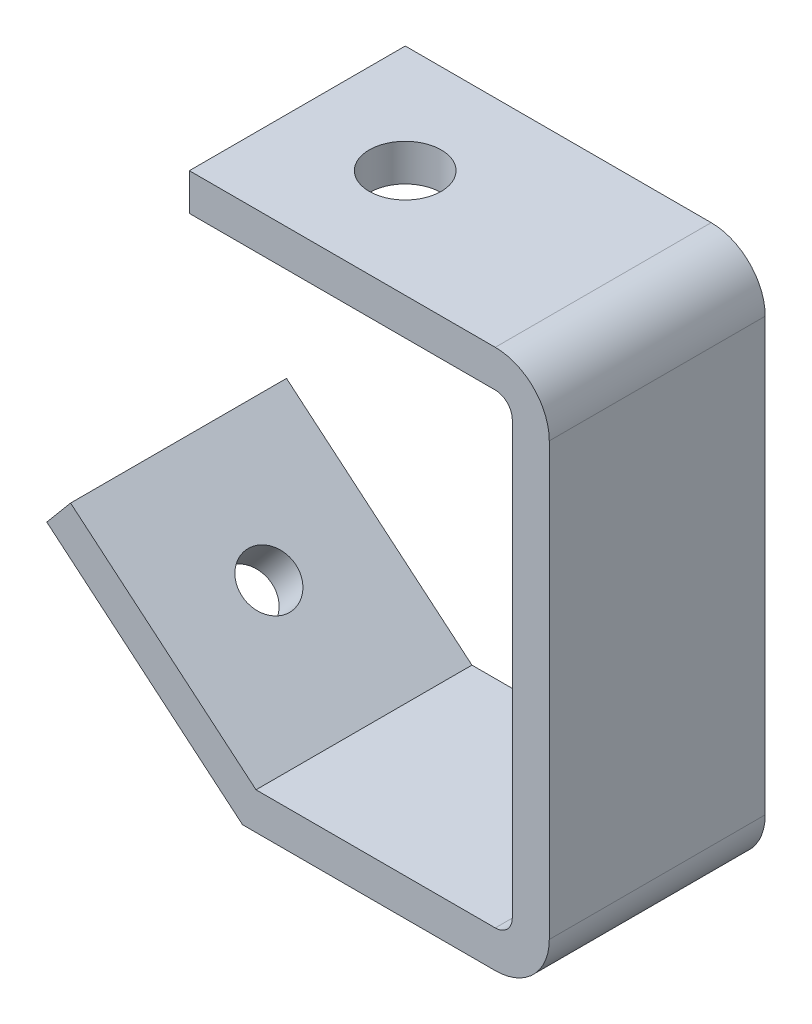
ISO-10303-21;
HEADER;
FILE_DESCRIPTION(('STEP AP214'),'2;1');
FILE_NAME('part.step','',(''),(''),'','','');
FILE_SCHEMA(('AUTOMOTIVE_DESIGN { 1 0 10303 214 1 1 1 1 }'));
ENDSEC;
DATA;
#1=APPLICATION_CONTEXT('core data for automotive mechanical design processes');
#2=APPLICATION_PROTOCOL_DEFINITION('international standard','automotive_design',2000,#1);
#3=PRODUCT_CONTEXT('',#1,'mechanical');
#4=PRODUCT('Part','Part','',(#3));
#5=PRODUCT_RELATED_PRODUCT_CATEGORY('part','',(#4));
#6=PRODUCT_DEFINITION_FORMATION('','',#4);
#7=PRODUCT_DEFINITION_CONTEXT('part definition',#1,'design');
#8=PRODUCT_DEFINITION('design','',#6,#7);
#9=PRODUCT_DEFINITION_SHAPE('','',#8);
#10=(LENGTH_UNIT() NAMED_UNIT(*) SI_UNIT(.MILLI.,.METRE.));
#11=(NAMED_UNIT(*) PLANE_ANGLE_UNIT() SI_UNIT($,.RADIAN.));
#12=(NAMED_UNIT(*) SI_UNIT($,.STERADIAN.) SOLID_ANGLE_UNIT());
#13=UNCERTAINTY_MEASURE_WITH_UNIT(LENGTH_MEASURE(1.E-05),#10,'distance_accuracy_value','');
#14=(GEOMETRIC_REPRESENTATION_CONTEXT(3) GLOBAL_UNCERTAINTY_ASSIGNED_CONTEXT((#13)) GLOBAL_UNIT_ASSIGNED_CONTEXT((#10,
#11,#12)) REPRESENTATION_CONTEXT('',''));
#15=CARTESIAN_POINT('',(0.,0.,0.));
#16=DIRECTION('',(0.,0.,1.));
#17=DIRECTION('',(1.,0.,0.));
#18=AXIS2_PLACEMENT_3D('',#15,#16,#17);
#19=CARTESIAN_POINT('',(0.,0.,19.05));
#20=DIRECTION('',(1.,0.,0.));
#21=DIRECTION('',(0.,0.,-1.));
#22=AXIS2_PLACEMENT_3D('',#19,#20,#21);
#23=PLANE('',#22);
#24=DIRECTION('',(0.,-1.,0.));
#25=VECTOR('',#24,1.);
#26=CARTESIAN_POINT('',(0.,0.,-19.05));
#27=LINE('',#26,#25);
#28=CARTESIAN_POINT('',(0.,0.,-19.05));
#29=VERTEX_POINT('',#28);
#30=CARTESIAN_POINT('',(0.,-6.53,-19.05));
#31=VERTEX_POINT('',#30);
#32=EDGE_CURVE('E182',#29,#31,#27,.T.);
#33=ORIENTED_EDGE('',*,*,#32,.T.);
#34=DIRECTION('',(0.,0.,-1.));
#35=VECTOR('',#34,1.);
#36=CARTESIAN_POINT('',(0.,-6.53,19.05));
#37=LINE('',#36,#35);
#38=CARTESIAN_POINT('',(0.,-6.53,19.05));
#39=VERTEX_POINT('',#38);
#40=EDGE_CURVE('E11',#39,#31,#37,.T.);
#41=ORIENTED_EDGE('',*,*,#40,.F.);
#42=DIRECTION('',(0.,-1.,0.));
#43=VECTOR('',#42,1.);
#44=CARTESIAN_POINT('',(0.,0.,19.05));
#45=LINE('',#44,#43);
#46=CARTESIAN_POINT('',(0.,0.,19.05));
#47=VERTEX_POINT('',#46);
#48=EDGE_CURVE('E223',#47,#39,#45,.T.);
#49=ORIENTED_EDGE('',*,*,#48,.F.);
#50=DIRECTION('',(0.,0.,-1.));
#51=VECTOR('',#50,1.);
#52=CARTESIAN_POINT('',(0.,0.,19.05));
#53=LINE('',#52,#51);
#54=EDGE_CURVE('E178',#47,#29,#53,.T.);
#55=ORIENTED_EDGE('',*,*,#54,.T.);
#56=EDGE_LOOP('',(#33,#41,#49,#55));
#57=FACE_BOUND('',#56,.T.);
#58=ADVANCED_FACE('F45',(#57),#23,.F.);
#59=CARTESIAN_POINT('',(0.,-6.53,19.05));
#60=DIRECTION('',(0.,1.,0.));
#61=DIRECTION('',(0.,0.,1.));
#62=AXIS2_PLACEMENT_3D('',#59,#60,#61);
#63=PLANE('',#62);
#64=CARTESIAN_POINT('',(19.04,-6.52999999999999,0.));
#65=DIRECTION('',(0.,1.,0.));
#66=DIRECTION('',(0.,0.,1.));
#67=AXIS2_PLACEMENT_3D('',#64,#65,#66);
#68=CIRCLE('',#67,6.35);
#69=CARTESIAN_POINT('',(19.04,-6.52999999999999,6.35));
#70=VERTEX_POINT('',#69);
#71=EDGE_CURVE('E187',#70,#70,#68,.F.);
#72=ORIENTED_EDGE('',*,*,#71,.F.);
#73=EDGE_LOOP('',(#72));
#74=FACE_BOUND('',#73,.T.);
#75=DIRECTION('',(1.,0.,0.));
#76=VECTOR('',#75,1.);
#77=CARTESIAN_POINT('',(0.,-6.53,-19.05));
#78=LINE('',#77,#76);
#79=CARTESIAN_POINT('',(53.98,-6.53,-19.05));
#80=VERTEX_POINT('',#79);
#81=EDGE_CURVE('E186',#31,#80,#78,.T.);
#82=ORIENTED_EDGE('',*,*,#81,.T.);
#83=DIRECTION('',(0.,0.,-1.));
#84=VECTOR('',#83,1.);
#85=CARTESIAN_POINT('',(53.98,-6.53,19.05));
#86=LINE('',#85,#84);
#87=CARTESIAN_POINT('',(53.98,-6.53,19.05));
#88=VERTEX_POINT('',#87);
#89=EDGE_CURVE('E54',#88,#80,#86,.T.);
#90=ORIENTED_EDGE('',*,*,#89,.F.);
#91=DIRECTION('',(1.,0.,0.));
#92=VECTOR('',#91,1.);
#93=CARTESIAN_POINT('',(0.,-6.53,19.05));
#94=LINE('',#93,#92);
#95=EDGE_CURVE('E123',#39,#88,#94,.T.);
#96=ORIENTED_EDGE('',*,*,#95,.F.);
#97=ORIENTED_EDGE('',*,*,#40,.T.);
#98=EDGE_LOOP('',(#82,#90,#96,#97));
#99=FACE_BOUND('',#98,.T.);
#100=ADVANCED_FACE('F333',(#74,#99),#63,.F.);
#101=CARTESIAN_POINT('',(53.98,-9.53,19.05));
#102=DIRECTION('',(0.,0.,-1.));
#103=DIRECTION('',(-1.,0.,0.));
#104=AXIS2_PLACEMENT_3D('',#101,#102,#103);
#105=CYLINDRICAL_SURFACE('',#104,2.99999999999999);
#106=CARTESIAN_POINT('',(53.98,-9.53,-19.05));
#107=DIRECTION('',(0.,0.,-1.));
#108=DIRECTION('',(-1.,0.,0.));
#109=AXIS2_PLACEMENT_3D('',#106,#107,#108);
#110=CIRCLE('',#109,2.99999999999999);
#111=CARTESIAN_POINT('',(56.98,-9.53,-19.05));
#112=VERTEX_POINT('',#111);
#113=EDGE_CURVE('E190',#80,#112,#110,.T.);
#114=ORIENTED_EDGE('',*,*,#113,.T.);
#115=DIRECTION('',(0.,0.,-1.));
#116=VECTOR('',#115,1.);
#117=CARTESIAN_POINT('',(56.98,-9.53,19.05));
#118=LINE('',#117,#116);
#119=CARTESIAN_POINT('',(56.98,-9.53,19.05));
#120=VERTEX_POINT('',#119);
#121=EDGE_CURVE('E258',#120,#112,#118,.T.);
#122=ORIENTED_EDGE('',*,*,#121,.F.);
#123=CARTESIAN_POINT('',(53.98,-9.53,19.05));
#124=DIRECTION('',(0.,0.,-1.));
#125=DIRECTION('',(-1.,0.,0.));
#126=AXIS2_PLACEMENT_3D('',#123,#124,#125);
#127=CIRCLE('',#126,2.99999999999999);
#128=EDGE_CURVE('E268',#88,#120,#127,.T.);
#129=ORIENTED_EDGE('',*,*,#128,.F.);
#130=ORIENTED_EDGE('',*,*,#89,.T.);
#131=EDGE_LOOP('',(#114,#122,#129,#130));
#132=FACE_BOUND('',#131,.T.);
#133=ADVANCED_FACE('F266',(#132),#105,.F.);
#134=CARTESIAN_POINT('',(56.98,-9.53,19.05));
#135=DIRECTION('',(1.,0.,0.));
#136=DIRECTION('',(0.,1.,0.));
#137=AXIS2_PLACEMENT_3D('',#134,#135,#136);
#138=PLANE('',#137);
#139=DIRECTION('',(0.,-1.,0.));
#140=VECTOR('',#139,1.);
#141=CARTESIAN_POINT('',(56.98,-9.53,-19.05));
#142=LINE('',#141,#140);
#143=CARTESIAN_POINT('',(56.98,-85.72,-19.05));
#144=VERTEX_POINT('',#143);
#145=EDGE_CURVE('E193',#112,#144,#142,.T.);
#146=ORIENTED_EDGE('',*,*,#145,.T.);
#147=DIRECTION('',(0.,0.,-1.));
#148=VECTOR('',#147,1.);
#149=CARTESIAN_POINT('',(56.98,-85.72,19.05));
#150=LINE('',#149,#148);
#151=CARTESIAN_POINT('',(56.98,-85.72,19.05));
#152=VERTEX_POINT('',#151);
#153=EDGE_CURVE('E254',#152,#144,#150,.T.);
#154=ORIENTED_EDGE('',*,*,#153,.F.);
#155=DIRECTION('',(0.,-1.,0.));
#156=VECTOR('',#155,1.);
#157=CARTESIAN_POINT('',(56.98,-9.53,19.05));
#158=LINE('',#157,#156);
#159=EDGE_CURVE('E287',#120,#152,#158,.T.);
#160=ORIENTED_EDGE('',*,*,#159,.F.);
#161=ORIENTED_EDGE('',*,*,#121,.T.);
#162=EDGE_LOOP('',(#146,#154,#160,#161));
#163=FACE_BOUND('',#162,.T.);
#164=ADVANCED_FACE('F277',(#163),#138,.F.);
#165=CARTESIAN_POINT('',(53.98,-85.72,19.05));
#166=DIRECTION('',(0.,0.,-1.));
#167=DIRECTION('',(-1.,0.,0.));
#168=AXIS2_PLACEMENT_3D('',#165,#166,#167);
#169=CYLINDRICAL_SURFACE('',#168,3.);
#170=CARTESIAN_POINT('',(53.98,-85.72,-19.05));
#171=DIRECTION('',(0.,0.,-1.));
#172=DIRECTION('',(-1.,0.,0.));
#173=AXIS2_PLACEMENT_3D('',#170,#171,#172);
#174=CIRCLE('',#173,3.);
#175=CARTESIAN_POINT('',(53.98,-88.72,-19.05));
#176=VERTEX_POINT('',#175);
#177=EDGE_CURVE('E196',#144,#176,#174,.T.);
#178=ORIENTED_EDGE('',*,*,#177,.T.);
#179=DIRECTION('',(0.,0.,-1.));
#180=VECTOR('',#179,1.);
#181=CARTESIAN_POINT('',(53.98,-88.72,19.05));
#182=LINE('',#181,#180);
#183=CARTESIAN_POINT('',(53.98,-88.72,19.05));
#184=VERTEX_POINT('',#183);
#185=EDGE_CURVE('E250',#184,#176,#182,.T.);
#186=ORIENTED_EDGE('',*,*,#185,.F.);
#187=CARTESIAN_POINT('',(53.98,-85.72,19.05));
#188=DIRECTION('',(0.,0.,-1.));
#189=DIRECTION('',(-1.,0.,0.));
#190=AXIS2_PLACEMENT_3D('',#187,#188,#189);
#191=CIRCLE('',#190,3.);
#192=EDGE_CURVE('E283',#152,#184,#191,.T.);
#193=ORIENTED_EDGE('',*,*,#192,.F.);
#194=ORIENTED_EDGE('',*,*,#153,.T.);
#195=EDGE_LOOP('',(#178,#186,#193,#194));
#196=FACE_BOUND('',#195,.T.);
#197=ADVANCED_FACE('F281',(#196),#169,.F.);
#198=CARTESIAN_POINT('',(53.98,-88.72,19.05));
#199=DIRECTION('',(0.,-1.,0.));
#200=DIRECTION('',(0.,0.,-1.));
#201=AXIS2_PLACEMENT_3D('',#198,#199,#200);
#202=PLANE('',#201);
#203=DIRECTION('',(-1.,0.,0.));
#204=VECTOR('',#203,1.);
#205=CARTESIAN_POINT('',(53.98,-88.72,-19.05));
#206=LINE('',#205,#204);
#207=CARTESIAN_POINT('',(11.7667256297583,-88.72,-19.05));
#208=VERTEX_POINT('',#207);
#209=EDGE_CURVE('E199',#176,#208,#206,.T.);
#210=ORIENTED_EDGE('',*,*,#209,.T.);
#211=DIRECTION('',(0.,0.,-1.));
#212=VECTOR('',#211,1.);
#213=CARTESIAN_POINT('',(11.7667256297583,-88.72,19.05));
#214=LINE('',#213,#212);
#215=CARTESIAN_POINT('',(11.7667256297583,-88.72,19.05));
#216=VERTEX_POINT('',#215);
#217=EDGE_CURVE('E246',#216,#208,#214,.T.);
#218=ORIENTED_EDGE('',*,*,#217,.F.);
#219=DIRECTION('',(-1.,0.,0.));
#220=VECTOR('',#219,1.);
#221=CARTESIAN_POINT('',(53.98,-88.72,19.05));
#222=LINE('',#221,#220);
#223=EDGE_CURVE('E286',#184,#216,#222,.T.);
#224=ORIENTED_EDGE('',*,*,#223,.F.);
#225=ORIENTED_EDGE('',*,*,#185,.T.);
#226=EDGE_LOOP('',(#210,#218,#224,#225));
#227=FACE_BOUND('',#226,.T.);
#228=ADVANCED_FACE('F348',(#227),#202,.F.);
#229=CARTESIAN_POINT('',(11.7667256297583,-88.72,19.05));
#230=DIRECTION('',(-0.64278760968654,-0.766044443118977,0.));
#231=DIRECTION('',(0.766044443118977,-0.64278760968654,0.));
#232=AXIS2_PLACEMENT_3D('',#229,#230,#231);
#233=PLANE('',#232);
#234=CARTESIAN_POINT('',(-5.01215598767566,-74.6408466232439,0.));
#235=DIRECTION('',(-0.64278760968654,-0.766044443118977,0.));
#236=DIRECTION('',(0.766044443118977,-0.64278760968654,0.));
#237=AXIS2_PLACEMENT_3D('',#234,#235,#236);
#238=CIRCLE('',#237,4.765);
#239=CARTESIAN_POINT('',(-1.36195421621374,-77.7037295834002,0.));
#240=VERTEX_POINT('',#239);
#241=EDGE_CURVE('E522',#240,#240,#238,.F.);
#242=ORIENTED_EDGE('',*,*,#241,.F.);
#243=EDGE_LOOP('',(#242));
#244=FACE_BOUND('',#243,.T.);
#245=DIRECTION('',(-0.766044443118977,0.64278760968654,0.));
#246=VECTOR('',#245,1.);
#247=CARTESIAN_POINT('',(11.7667256297583,-88.72,-19.05));
#248=LINE('',#247,#246);
#249=CARTESIAN_POINT('',(-20.9535408489816,-61.264436465667,-19.05));
#250=VERTEX_POINT('',#249);
#251=EDGE_CURVE('E202',#208,#250,#248,.T.);
#252=ORIENTED_EDGE('',*,*,#251,.T.);
#253=DIRECTION('',(0.,0.,-1.));
#254=VECTOR('',#253,1.);
#255=CARTESIAN_POINT('',(-20.9535408489816,-61.264436465667,19.05));
#256=LINE('',#255,#254);
#257=CARTESIAN_POINT('',(-20.9535408489816,-61.264436465667,19.05));
#258=VERTEX_POINT('',#257);
#259=EDGE_CURVE('E242',#258,#250,#256,.T.);
#260=ORIENTED_EDGE('',*,*,#259,.F.);
#261=DIRECTION('',(-0.766044443118977,0.64278760968654,0.));
#262=VECTOR('',#261,1.);
#263=CARTESIAN_POINT('',(11.7667256297583,-88.72,19.05));
#264=LINE('',#263,#262);
#265=EDGE_CURVE('E291',#216,#258,#264,.T.);
#266=ORIENTED_EDGE('',*,*,#265,.F.);
#267=ORIENTED_EDGE('',*,*,#217,.T.);
#268=EDGE_LOOP('',(#252,#260,#266,#267));
#269=FACE_BOUND('',#268,.T.);
#270=ADVANCED_FACE('F351',(#244,#269),#233,.F.);
#271=CARTESIAN_POINT('',(-20.9535408489816,-61.264436465667,19.05));
#272=DIRECTION('',(0.766044443118976,-0.642787609686541,0.));
#273=DIRECTION('',(0.642787609686541,0.766044443118976,0.));
#274=AXIS2_PLACEMENT_3D('',#271,#272,#273);
#275=PLANE('',#274);
#276=DIRECTION('',(-0.642787609686541,-0.766044443118976,0.));
#277=VECTOR('',#276,1.);
#278=CARTESIAN_POINT('',(-20.9535408489816,-61.264436465667,-19.05));
#279=LINE('',#278,#277);
#280=CARTESIAN_POINT('',(-25.1509439402347,-66.2667066792339,-19.05));
#281=VERTEX_POINT('',#280);
#282=EDGE_CURVE('E205',#250,#281,#279,.T.);
#283=ORIENTED_EDGE('',*,*,#282,.T.);
#284=DIRECTION('',(0.,0.,-1.));
#285=VECTOR('',#284,1.);
#286=CARTESIAN_POINT('',(-25.1509439402347,-66.2667066792339,19.05));
#287=LINE('',#286,#285);
#288=CARTESIAN_POINT('',(-25.1509439402347,-66.2667066792339,19.05));
#289=VERTEX_POINT('',#288);
#290=EDGE_CURVE('E238',#289,#281,#287,.T.);
#291=ORIENTED_EDGE('',*,*,#290,.F.);
#292=DIRECTION('',(-0.642787609686541,-0.766044443118976,0.));
#293=VECTOR('',#292,1.);
#294=CARTESIAN_POINT('',(-20.9535408489816,-61.264436465667,19.05));
#295=LINE('',#294,#293);
#296=EDGE_CURVE('E298',#258,#289,#295,.T.);
#297=ORIENTED_EDGE('',*,*,#296,.F.);
#298=ORIENTED_EDGE('',*,*,#259,.T.);
#299=EDGE_LOOP('',(#283,#291,#297,#298));
#300=FACE_BOUND('',#299,.T.);
#301=ADVANCED_FACE('F355',(#300),#275,.F.);
#302=CARTESIAN_POINT('',(9.39000000000002,-95.25,19.05));
#303=DIRECTION('',(0.64278760968654,0.766044443118977,0.));
#304=DIRECTION('',(-0.766044443118977,0.64278760968654,0.));
#305=AXIS2_PLACEMENT_3D('',#302,#303,#304);
#306=PLANE('',#305);
#307=CARTESIAN_POINT('',(-9.20955907892877,-79.6431168368108,0.));
#308=DIRECTION('',(-0.64278760968654,-0.766044443118977,0.));
#309=DIRECTION('',(0.766044443118977,-0.64278760968654,0.));
#310=AXIS2_PLACEMENT_3D('',#307,#308,#309);
#311=CIRCLE('',#310,4.765);
#312=CARTESIAN_POINT('',(-5.55935730746684,-82.7059997969671,0.));
#313=VERTEX_POINT('',#312);
#314=EDGE_CURVE('E519',#313,#313,#311,.T.);
#315=ORIENTED_EDGE('',*,*,#314,.F.);
#316=EDGE_LOOP('',(#315));
#317=FACE_BOUND('',#316,.T.);
#318=DIRECTION('',(0.766044443118977,-0.64278760968654,0.));
#319=VECTOR('',#318,1.);
#320=CARTESIAN_POINT('',(9.39000000000002,-95.25,-19.05));
#321=LINE('',#320,#319);
#322=CARTESIAN_POINT('',(9.39000000000002,-95.25,-19.05));
#323=VERTEX_POINT('',#322);
#324=EDGE_CURVE('E208',#281,#323,#321,.T.);
#325=ORIENTED_EDGE('',*,*,#324,.T.);
#326=DIRECTION('',(0.,0.,-1.));
#327=VECTOR('',#326,1.);
#328=CARTESIAN_POINT('',(9.39000000000002,-95.25,19.05));
#329=LINE('',#328,#327);
#330=CARTESIAN_POINT('',(9.39000000000002,-95.25,19.05));
#331=VERTEX_POINT('',#330);
#332=EDGE_CURVE('E234',#331,#323,#329,.T.);
#333=ORIENTED_EDGE('',*,*,#332,.F.);
#334=DIRECTION('',(0.766044443118977,-0.64278760968654,0.));
#335=VECTOR('',#334,1.);
#336=CARTESIAN_POINT('',(9.39000000000002,-95.25,19.05));
#337=LINE('',#336,#335);
#338=EDGE_CURVE('E301',#289,#331,#337,.T.);
#339=ORIENTED_EDGE('',*,*,#338,.F.);
#340=ORIENTED_EDGE('',*,*,#290,.T.);
#341=EDGE_LOOP('',(#325,#333,#339,#340));
#342=FACE_BOUND('',#341,.T.);
#343=ADVANCED_FACE('F359',(#317,#342),#306,.F.);
#344=CARTESIAN_POINT('',(53.98,-95.25,19.05));
#345=DIRECTION('',(0.,1.,0.));
#346=DIRECTION('',(0.,0.,1.));
#347=AXIS2_PLACEMENT_3D('',#344,#345,#346);
#348=PLANE('',#347);
#349=DIRECTION('',(1.,0.,0.));
#350=VECTOR('',#349,1.);
#351=CARTESIAN_POINT('',(53.98,-95.25,-19.05));
#352=LINE('',#351,#350);
#353=CARTESIAN_POINT('',(53.98,-95.25,-19.05));
#354=VERTEX_POINT('',#353);
#355=EDGE_CURVE('E211',#323,#354,#352,.T.);
#356=ORIENTED_EDGE('',*,*,#355,.T.);
#357=DIRECTION('',(0.,0.,-1.));
#358=VECTOR('',#357,1.);
#359=CARTESIAN_POINT('',(53.98,-95.25,19.05));
#360=LINE('',#359,#358);
#361=CARTESIAN_POINT('',(53.98,-95.25,19.05));
#362=VERTEX_POINT('',#361);
#363=EDGE_CURVE('E230',#362,#354,#360,.T.);
#364=ORIENTED_EDGE('',*,*,#363,.F.);
#365=DIRECTION('',(1.,0.,0.));
#366=VECTOR('',#365,1.);
#367=CARTESIAN_POINT('',(53.98,-95.25,19.05));
#368=LINE('',#367,#366);
#369=EDGE_CURVE('E304',#331,#362,#368,.T.);
#370=ORIENTED_EDGE('',*,*,#369,.F.);
#371=ORIENTED_EDGE('',*,*,#332,.T.);
#372=EDGE_LOOP('',(#356,#364,#370,#371));
#373=FACE_BOUND('',#372,.T.);
#374=ADVANCED_FACE('F312',(#373),#348,.F.);
#375=CARTESIAN_POINT('',(53.98,-85.72,19.05));
#376=DIRECTION('',(0.,0.,-1.));
#377=DIRECTION('',(-1.,0.,0.));
#378=AXIS2_PLACEMENT_3D('',#375,#376,#377);
#379=CYLINDRICAL_SURFACE('',#378,9.53000000000001);
#380=CARTESIAN_POINT('',(53.98,-85.72,-19.05));
#381=DIRECTION('',(0.,0.,1.));
#382=DIRECTION('',(-1.,0.,0.));
#383=AXIS2_PLACEMENT_3D('',#380,#381,#382);
#384=CIRCLE('',#383,9.53000000000001);
#385=CARTESIAN_POINT('',(63.51,-85.72,-19.05));
#386=VERTEX_POINT('',#385);
#387=EDGE_CURVE('E214',#354,#386,#384,.T.);
#388=ORIENTED_EDGE('',*,*,#387,.T.);
#389=DIRECTION('',(0.,0.,-1.));
#390=VECTOR('',#389,1.);
#391=CARTESIAN_POINT('',(63.51,-85.72,19.05));
#392=LINE('',#391,#390);
#393=CARTESIAN_POINT('',(63.51,-85.72,19.05));
#394=VERTEX_POINT('',#393);
#395=EDGE_CURVE('E171',#394,#386,#392,.T.);
#396=ORIENTED_EDGE('',*,*,#395,.F.);
#397=CARTESIAN_POINT('',(53.98,-85.72,19.05));
#398=DIRECTION('',(0.,0.,1.));
#399=DIRECTION('',(-1.,0.,0.));
#400=AXIS2_PLACEMENT_3D('',#397,#398,#399);
#401=CIRCLE('',#400,9.53000000000001);
#402=EDGE_CURVE('E160',#362,#394,#401,.T.);
#403=ORIENTED_EDGE('',*,*,#402,.F.);
#404=ORIENTED_EDGE('',*,*,#363,.T.);
#405=EDGE_LOOP('',(#388,#396,#403,#404));
#406=FACE_BOUND('',#405,.T.);
#407=ADVANCED_FACE('F316',(#406),#379,.T.);
#408=CARTESIAN_POINT('',(63.51,-9.53,19.05));
#409=DIRECTION('',(-1.,0.,0.));
#410=DIRECTION('',(0.,-1.,0.));
#411=AXIS2_PLACEMENT_3D('',#408,#409,#410);
#412=PLANE('',#411);
#413=DIRECTION('',(0.,1.,0.));
#414=VECTOR('',#413,1.);
#415=CARTESIAN_POINT('',(63.51,-9.53,-19.05));
#416=LINE('',#415,#414);
#417=CARTESIAN_POINT('',(63.51,-9.53,-19.05));
#418=VERTEX_POINT('',#417);
#419=EDGE_CURVE('E169',#386,#418,#416,.T.);
#420=ORIENTED_EDGE('',*,*,#419,.T.);
#421=DIRECTION('',(0.,0.,-1.));
#422=VECTOR('',#421,1.);
#423=CARTESIAN_POINT('',(63.51,-9.53,19.05));
#424=LINE('',#423,#422);
#425=CARTESIAN_POINT('',(63.51,-9.53,19.05));
#426=VERTEX_POINT('',#425);
#427=EDGE_CURVE('E166',#426,#418,#424,.T.);
#428=ORIENTED_EDGE('',*,*,#427,.F.);
#429=DIRECTION('',(0.,1.,0.));
#430=VECTOR('',#429,1.);
#431=CARTESIAN_POINT('',(63.51,-9.53,19.05));
#432=LINE('',#431,#430);
#433=EDGE_CURVE('E154',#394,#426,#432,.T.);
#434=ORIENTED_EDGE('',*,*,#433,.F.);
#435=ORIENTED_EDGE('',*,*,#395,.T.);
#436=EDGE_LOOP('',(#420,#428,#434,#435));
#437=FACE_BOUND('',#436,.T.);
#438=ADVANCED_FACE('F167',(#437),#412,.F.);
#439=CARTESIAN_POINT('',(53.98,-9.53,19.05));
#440=DIRECTION('',(0.,0.,-1.));
#441=DIRECTION('',(-1.,0.,0.));
#442=AXIS2_PLACEMENT_3D('',#439,#440,#441);
#443=CYLINDRICAL_SURFACE('',#442,9.52999999999999);
#444=CARTESIAN_POINT('',(53.98,-9.53,-19.05));
#445=DIRECTION('',(0.,0.,1.));
#446=DIRECTION('',(-1.,0.,0.));
#447=AXIS2_PLACEMENT_3D('',#444,#445,#446);
#448=CIRCLE('',#447,9.52999999999999);
#449=CARTESIAN_POINT('',(53.98,0.,-19.05));
#450=VERTEX_POINT('',#449);
#451=EDGE_CURVE('E109',#418,#450,#448,.T.);
#452=ORIENTED_EDGE('',*,*,#451,.T.);
#453=DIRECTION('',(0.,0.,-1.));
#454=VECTOR('',#453,1.);
#455=CARTESIAN_POINT('',(53.98,0.,19.05));
#456=LINE('',#455,#454);
#457=CARTESIAN_POINT('',(53.98,0.,19.05));
#458=VERTEX_POINT('',#457);
#459=EDGE_CURVE('E172',#458,#450,#456,.T.);
#460=ORIENTED_EDGE('',*,*,#459,.F.);
#461=CARTESIAN_POINT('',(53.98,-9.53,19.05));
#462=DIRECTION('',(0.,0.,1.));
#463=DIRECTION('',(-1.,0.,0.));
#464=AXIS2_PLACEMENT_3D('',#461,#462,#463);
#465=CIRCLE('',#464,9.52999999999999);
#466=EDGE_CURVE('E158',#426,#458,#465,.T.);
#467=ORIENTED_EDGE('',*,*,#466,.F.);
#468=ORIENTED_EDGE('',*,*,#427,.T.);
#469=EDGE_LOOP('',(#452,#460,#467,#468));
#470=FACE_BOUND('',#469,.T.);
#471=ADVANCED_FACE('F174',(#470),#443,.T.);
#472=CARTESIAN_POINT('',(0.,0.,19.05));
#473=DIRECTION('',(0.,-1.,0.));
#474=DIRECTION('',(0.,0.,-1.));
#475=AXIS2_PLACEMENT_3D('',#472,#473,#474);
#476=PLANE('',#475);
#477=CARTESIAN_POINT('',(19.04,0.,0.));
#478=DIRECTION('',(0.,1.,0.));
#479=DIRECTION('',(0.,0.,1.));
#480=AXIS2_PLACEMENT_3D('',#477,#478,#479);
#481=CIRCLE('',#480,6.35);
#482=CARTESIAN_POINT('',(19.04,0.,6.35));
#483=VERTEX_POINT('',#482);
#484=EDGE_CURVE('E524',#483,#483,#481,.T.);
#485=ORIENTED_EDGE('',*,*,#484,.F.);
#486=EDGE_LOOP('',(#485));
#487=FACE_BOUND('',#486,.T.);
#488=DIRECTION('',(-1.,0.,0.));
#489=VECTOR('',#488,1.);
#490=CARTESIAN_POINT('',(0.,0.,-19.05));
#491=LINE('',#490,#489);
#492=EDGE_CURVE('E115',#450,#29,#491,.T.);
#493=ORIENTED_EDGE('',*,*,#492,.T.);
#494=ORIENTED_EDGE('',*,*,#54,.F.);
#495=DIRECTION('',(-1.,0.,0.));
#496=VECTOR('',#495,1.);
#497=CARTESIAN_POINT('',(0.,0.,19.05));
#498=LINE('',#497,#496);
#499=EDGE_CURVE('E62',#458,#47,#498,.T.);
#500=ORIENTED_EDGE('',*,*,#499,.F.);
#501=ORIENTED_EDGE('',*,*,#459,.T.);
#502=EDGE_LOOP('',(#493,#494,#500,#501));
#503=FACE_BOUND('',#502,.T.);
#504=ADVANCED_FACE('F320',(#487,#503),#476,.F.);
#505=CARTESIAN_POINT('',(53.98,-9.53,19.05));
#506=DIRECTION('',(0.,0.,-1.));
#507=DIRECTION('',(-1.,0.,0.));
#508=AXIS2_PLACEMENT_3D('',#505,#506,#507);
#509=PLANE('',#508);
#510=ORIENTED_EDGE('',*,*,#48,.T.);
#511=ORIENTED_EDGE('',*,*,#95,.T.);
#512=ORIENTED_EDGE('',*,*,#128,.T.);
#513=ORIENTED_EDGE('',*,*,#159,.T.);
#514=ORIENTED_EDGE('',*,*,#192,.T.);
#515=ORIENTED_EDGE('',*,*,#223,.T.);
#516=ORIENTED_EDGE('',*,*,#265,.T.);
#517=ORIENTED_EDGE('',*,*,#296,.T.);
#518=ORIENTED_EDGE('',*,*,#338,.T.);
#519=ORIENTED_EDGE('',*,*,#369,.T.);
#520=ORIENTED_EDGE('',*,*,#402,.T.);
#521=ORIENTED_EDGE('',*,*,#433,.T.);
#522=ORIENTED_EDGE('',*,*,#466,.T.);
#523=ORIENTED_EDGE('',*,*,#499,.T.);
#524=EDGE_LOOP('',(#510,#511,#512,#513,#514,#515,#516,#517,#518,#519,#520,#521,#522,#523));
#525=FACE_BOUND('',#524,.T.);
#526=ADVANCED_FACE('F156',(#525),#509,.F.);
#527=CARTESIAN_POINT('',(53.98,-9.53,-19.05));
#528=DIRECTION('',(0.,0.,-1.));
#529=DIRECTION('',(-1.,0.,0.));
#530=AXIS2_PLACEMENT_3D('',#527,#528,#529);
#531=PLANE('',#530);
#532=ORIENTED_EDGE('',*,*,#32,.F.);
#533=ORIENTED_EDGE('',*,*,#492,.F.);
#534=ORIENTED_EDGE('',*,*,#451,.F.);
#535=ORIENTED_EDGE('',*,*,#419,.F.);
#536=ORIENTED_EDGE('',*,*,#387,.F.);
#537=ORIENTED_EDGE('',*,*,#355,.F.);
#538=ORIENTED_EDGE('',*,*,#324,.F.);
#539=ORIENTED_EDGE('',*,*,#282,.F.);
#540=ORIENTED_EDGE('',*,*,#251,.F.);
#541=ORIENTED_EDGE('',*,*,#209,.F.);
#542=ORIENTED_EDGE('',*,*,#177,.F.);
#543=ORIENTED_EDGE('',*,*,#145,.F.);
#544=ORIENTED_EDGE('',*,*,#113,.F.);
#545=ORIENTED_EDGE('',*,*,#81,.F.);
#546=EDGE_LOOP('',(#532,#533,#534,#535,#536,#537,#538,#539,#540,#541,#542,#543,#544,#545));
#547=FACE_BOUND('',#546,.T.);
#548=ADVANCED_FACE('F272',(#547),#531,.T.);
#549=CARTESIAN_POINT('',(19.04,-95.251,0.));
#550=DIRECTION('',(0.,1.,0.));
#551=DIRECTION('',(0.,0.,1.));
#552=AXIS2_PLACEMENT_3D('',#549,#550,#551);
#553=CYLINDRICAL_SURFACE('',#552,6.35);
#554=ORIENTED_EDGE('',*,*,#484,.T.);
#555=EDGE_LOOP('',(#554));
#556=FACE_BOUND('',#555,.T.);
#557=ORIENTED_EDGE('',*,*,#71,.T.);
#558=EDGE_LOOP('',(#557));
#559=FACE_BOUND('',#558,.T.);
#560=ADVANCED_FACE('F394',(#556,#559),#553,.F.);
#561=CARTESIAN_POINT('',(60.0538960503983,2.90185464905234,0.));
#562=DIRECTION('',(-0.64278760968654,-0.766044443118977,0.));
#563=DIRECTION('',(0.766044443118977,-0.64278760968654,0.));
#564=AXIS2_PLACEMENT_3D('',#561,#562,#563);
#565=CYLINDRICAL_SURFACE('',#564,4.765);
#566=ORIENTED_EDGE('',*,*,#314,.T.);
#567=EDGE_LOOP('',(#566));
#568=FACE_BOUND('',#567,.T.);
#569=ORIENTED_EDGE('',*,*,#241,.T.);
#570=EDGE_LOOP('',(#569));
#571=FACE_BOUND('',#570,.T.);
#572=ADVANCED_FACE('F415',(#568,#571),#565,.F.);
#573=CLOSED_SHELL('',(#58,#100,#133,#164,#197,#228,#270,#301,#343,#374,#407,#438,#471,#504,#526,
#548,#560,#572));
#574=MANIFOLD_SOLID_BREP('B2',#573);
#575=ADVANCED_BREP_SHAPE_REPRESENTATION('',(#18,#574),#14);
#576=SHAPE_DEFINITION_REPRESENTATION(#9,#575);
ENDSEC;
END-ISO-10303-21;
